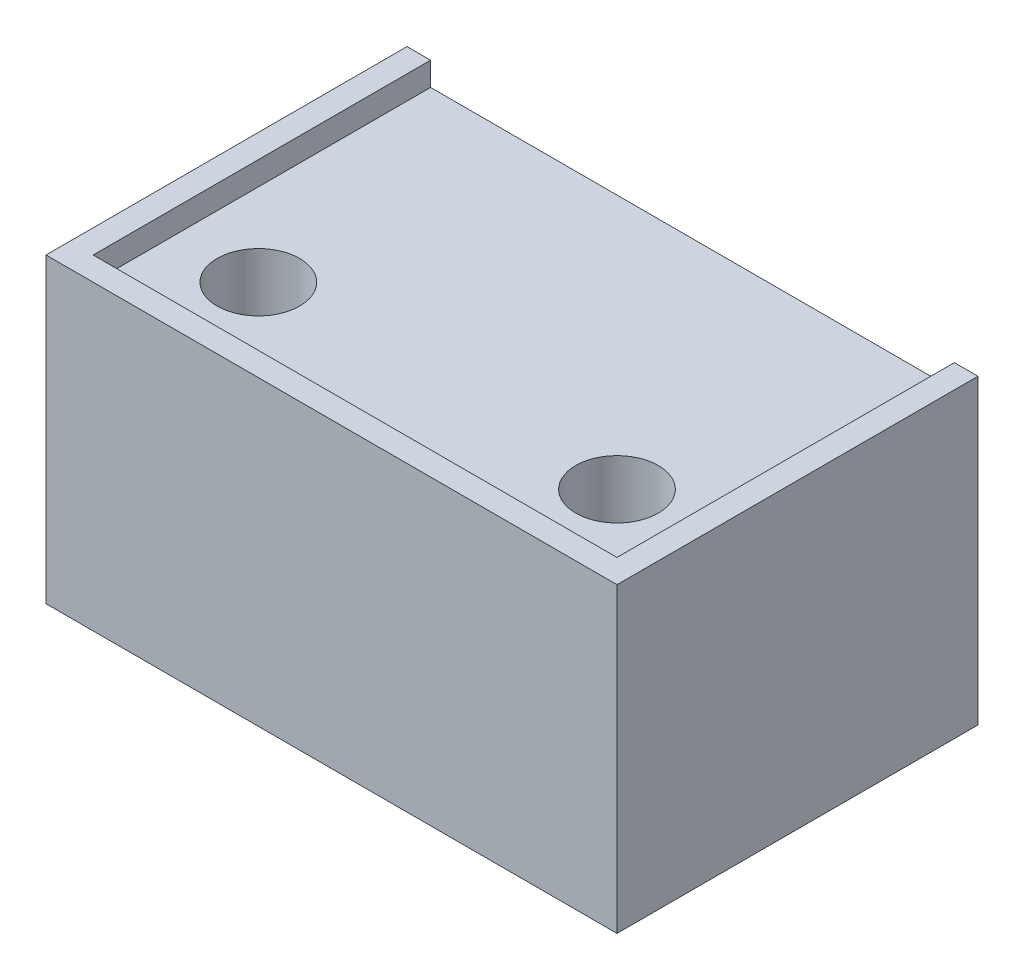
ISO-10303-21;
HEADER;
FILE_DESCRIPTION(('STEP AP214'),'2;1');
FILE_NAME('part.step','',(''),(''),'','','');
FILE_SCHEMA(('AUTOMOTIVE_DESIGN { 1 0 10303 214 1 1 1 1 }'));
ENDSEC;
DATA;
#1=APPLICATION_CONTEXT('core data for automotive mechanical design processes');
#2=APPLICATION_PROTOCOL_DEFINITION('international standard','automotive_design',2000,#1);
#3=PRODUCT_CONTEXT('',#1,'mechanical');
#4=PRODUCT('Part','Part','',(#3));
#5=PRODUCT_RELATED_PRODUCT_CATEGORY('part','',(#4));
#6=PRODUCT_DEFINITION_FORMATION('','',#4);
#7=PRODUCT_DEFINITION_CONTEXT('part definition',#1,'design');
#8=PRODUCT_DEFINITION('design','',#6,#7);
#9=PRODUCT_DEFINITION_SHAPE('','',#8);
#10=(LENGTH_UNIT() NAMED_UNIT(*) SI_UNIT(.MILLI.,.METRE.));
#11=(NAMED_UNIT(*) PLANE_ANGLE_UNIT() SI_UNIT($,.RADIAN.));
#12=(NAMED_UNIT(*) SI_UNIT($,.STERADIAN.) SOLID_ANGLE_UNIT());
#13=UNCERTAINTY_MEASURE_WITH_UNIT(LENGTH_MEASURE(1.E-05),#10,'distance_accuracy_value','');
#14=(GEOMETRIC_REPRESENTATION_CONTEXT(3) GLOBAL_UNCERTAINTY_ASSIGNED_CONTEXT((#13)) GLOBAL_UNIT_ASSIGNED_CONTEXT((#10,
#11,#12)) REPRESENTATION_CONTEXT('',''));
#15=CARTESIAN_POINT('',(0.,0.,0.));
#16=DIRECTION('',(0.,0.,1.));
#17=DIRECTION('',(1.,0.,0.));
#18=AXIS2_PLACEMENT_3D('',#15,#16,#17);
#19=CARTESIAN_POINT('',(0.,11.8,-6.65));
#20=DIRECTION('',(0.,0.,-1.));
#21=DIRECTION('',(-1.,0.,0.));
#22=AXIS2_PLACEMENT_3D('',#19,#20,#21);
#23=PLANE('',#22);
#24=DIRECTION('',(1.,0.,0.));
#25=VECTOR('',#24,1.);
#26=CARTESIAN_POINT('',(0.,0.,-6.65));
#27=LINE('',#26,#25);
#28=CARTESIAN_POINT('',(-12.1,0.,-6.65000000000001));
#29=VERTEX_POINT('',#28);
#30=CARTESIAN_POINT('',(12.1,0.,-6.65000000000001));
#31=VERTEX_POINT('',#30);
#32=EDGE_CURVE('E139',#29,#31,#27,.T.);
#33=ORIENTED_EDGE('',*,*,#32,.F.);
#34=DIRECTION('',(0.,-1.,0.));
#35=VECTOR('',#34,1.);
#36=CARTESIAN_POINT('',(-12.1,12.8,-6.65000000000001));
#37=LINE('',#36,#35);
#38=CARTESIAN_POINT('',(-12.1,12.8,-6.65000000000001));
#39=VERTEX_POINT('',#38);
#40=EDGE_CURVE('E351',#39,#29,#37,.T.);
#41=ORIENTED_EDGE('',*,*,#40,.F.);
#42=DIRECTION('',(-1.,0.,0.));
#43=VECTOR('',#42,1.);
#44=CARTESIAN_POINT('',(0.,12.8,-6.65000000000001));
#45=LINE('',#44,#43);
#46=CARTESIAN_POINT('',(-11.1,12.8,-6.65000000000001));
#47=VERTEX_POINT('',#46);
#48=EDGE_CURVE('E377',#47,#39,#45,.T.);
#49=ORIENTED_EDGE('',*,*,#48,.F.);
#50=DIRECTION('',(0.,-1.,0.));
#51=VECTOR('',#50,1.);
#52=CARTESIAN_POINT('',(-11.1,12.8,-6.65000000000001));
#53=LINE('',#52,#51);
#54=CARTESIAN_POINT('',(-11.1,11.8,-6.65000000000001));
#55=VERTEX_POINT('',#54);
#56=EDGE_CURVE('E355',#47,#55,#53,.T.);
#57=ORIENTED_EDGE('',*,*,#56,.T.);
#58=DIRECTION('',(1.,0.,0.));
#59=VECTOR('',#58,1.);
#60=CARTESIAN_POINT('',(0.,11.8,-6.65));
#61=LINE('',#60,#59);
#62=CARTESIAN_POINT('',(11.1,11.8,-6.65000000000001));
#63=VERTEX_POINT('',#62);
#64=EDGE_CURVE('E152',#55,#63,#61,.T.);
#65=ORIENTED_EDGE('',*,*,#64,.T.);
#66=DIRECTION('',(0.,-1.,0.));
#67=VECTOR('',#66,1.);
#68=CARTESIAN_POINT('',(11.1,12.8,-6.65000000000001));
#69=LINE('',#68,#67);
#70=CARTESIAN_POINT('',(11.1,12.8,-6.65000000000001));
#71=VERTEX_POINT('',#70);
#72=EDGE_CURVE('E117',#71,#63,#69,.T.);
#73=ORIENTED_EDGE('',*,*,#72,.F.);
#74=DIRECTION('',(-1.,0.,0.));
#75=VECTOR('',#74,1.);
#76=CARTESIAN_POINT('',(0.,12.8,-6.65000000000001));
#77=LINE('',#76,#75);
#78=CARTESIAN_POINT('',(12.1,12.8,-6.65000000000001));
#79=VERTEX_POINT('',#78);
#80=EDGE_CURVE('E110',#79,#71,#77,.T.);
#81=ORIENTED_EDGE('',*,*,#80,.F.);
#82=DIRECTION('',(0.,-1.,0.));
#83=VECTOR('',#82,1.);
#84=CARTESIAN_POINT('',(12.1,12.8,-6.65000000000001));
#85=LINE('',#84,#83);
#86=EDGE_CURVE('E113',#79,#31,#85,.T.);
#87=ORIENTED_EDGE('',*,*,#86,.T.);
#88=EDGE_LOOP('',(#33,#41,#49,#57,#65,#73,#81,#87));
#89=FACE_BOUND('',#88,.T.);
#90=ADVANCED_FACE('F45',(#89),#23,.T.);
#91=CARTESIAN_POINT('',(-7.6,11.8,4.14999999999999));
#92=DIRECTION('',(0.,-1.,0.));
#93=DIRECTION('',(0.,0.,-1.));
#94=AXIS2_PLACEMENT_3D('',#91,#92,#93);
#95=CYLINDRICAL_SURFACE('',#94,1.75);
#96=CARTESIAN_POINT('',(-7.6,11.8,4.14999999999999));
#97=DIRECTION('',(0.,1.,0.));
#98=DIRECTION('',(0.,0.,1.));
#99=AXIS2_PLACEMENT_3D('',#96,#97,#98);
#100=CIRCLE('',#99,1.75);
#101=CARTESIAN_POINT('',(-7.6,11.8,5.89999999999999));
#102=VERTEX_POINT('',#101);
#103=EDGE_CURVE('E54',#102,#102,#100,.T.);
#104=ORIENTED_EDGE('',*,*,#103,.T.);
#105=EDGE_LOOP('',(#104));
#106=FACE_BOUND('',#105,.T.);
#107=CARTESIAN_POINT('',(-7.6,0.,4.14999999999999));
#108=DIRECTION('',(0.,1.,0.));
#109=DIRECTION('',(0.,0.,1.));
#110=AXIS2_PLACEMENT_3D('',#107,#108,#109);
#111=CIRCLE('',#110,1.75);
#112=CARTESIAN_POINT('',(-7.6,0.,5.89999999999999));
#113=VERTEX_POINT('',#112);
#114=EDGE_CURVE('E143',#113,#113,#111,.T.);
#115=ORIENTED_EDGE('',*,*,#114,.F.);
#116=EDGE_LOOP('',(#115));
#117=FACE_BOUND('',#116,.T.);
#118=ADVANCED_FACE('F185',(#106,#117),#95,.F.);
#119=CARTESIAN_POINT('',(7.6,11.8,4.14999999999999));
#120=DIRECTION('',(0.,-1.,0.));
#121=DIRECTION('',(0.,0.,-1.));
#122=AXIS2_PLACEMENT_3D('',#119,#120,#121);
#123=CYLINDRICAL_SURFACE('',#122,1.75);
#124=CARTESIAN_POINT('',(7.6,11.8,4.14999999999999));
#125=DIRECTION('',(0.,1.,0.));
#126=DIRECTION('',(0.,0.,1.));
#127=AXIS2_PLACEMENT_3D('',#124,#125,#126);
#128=CIRCLE('',#127,1.75);
#129=CARTESIAN_POINT('',(7.6,11.8,5.89999999999999));
#130=VERTEX_POINT('',#129);
#131=EDGE_CURVE('E11',#130,#130,#128,.F.);
#132=ORIENTED_EDGE('',*,*,#131,.F.);
#133=EDGE_LOOP('',(#132));
#134=FACE_BOUND('',#133,.T.);
#135=CARTESIAN_POINT('',(7.6,0.,4.14999999999999));
#136=DIRECTION('',(0.,1.,0.));
#137=DIRECTION('',(0.,0.,1.));
#138=AXIS2_PLACEMENT_3D('',#135,#136,#137);
#139=CIRCLE('',#138,1.75);
#140=CARTESIAN_POINT('',(7.6,0.,5.89999999999999));
#141=VERTEX_POINT('',#140);
#142=EDGE_CURVE('E48',#141,#141,#139,.F.);
#143=ORIENTED_EDGE('',*,*,#142,.T.);
#144=EDGE_LOOP('',(#143));
#145=FACE_BOUND('',#144,.T.);
#146=ADVANCED_FACE('F169',(#134,#145),#123,.F.);
#147=CARTESIAN_POINT('',(0.,11.8,0.));
#148=DIRECTION('',(0.,1.,0.));
#149=DIRECTION('',(0.,0.,1.));
#150=AXIS2_PLACEMENT_3D('',#147,#148,#149);
#151=PLANE('',#150);
#152=DIRECTION('',(0.,0.,-1.));
#153=VECTOR('',#152,1.);
#154=CARTESIAN_POINT('',(11.1,11.8,0.));
#155=LINE('',#154,#153);
#156=CARTESIAN_POINT('',(11.1,11.8,7.64999999999999));
#157=VERTEX_POINT('',#156);
#158=EDGE_CURVE('E149',#157,#63,#155,.T.);
#159=ORIENTED_EDGE('',*,*,#158,.T.);
#160=ORIENTED_EDGE('',*,*,#64,.F.);
#161=DIRECTION('',(0.,0.,1.));
#162=VECTOR('',#161,1.);
#163=CARTESIAN_POINT('',(-11.1,11.8,0.));
#164=LINE('',#163,#162);
#165=CARTESIAN_POINT('',(-11.1,11.8,7.64999999999999));
#166=VERTEX_POINT('',#165);
#167=EDGE_CURVE('E67',#55,#166,#164,.T.);
#168=ORIENTED_EDGE('',*,*,#167,.T.);
#169=DIRECTION('',(1.,0.,0.));
#170=VECTOR('',#169,1.);
#171=CARTESIAN_POINT('',(0.,11.8,7.64999999999999));
#172=LINE('',#171,#170);
#173=EDGE_CURVE('E62',#166,#157,#172,.T.);
#174=ORIENTED_EDGE('',*,*,#173,.T.);
#175=EDGE_LOOP('',(#159,#160,#168,#174));
#176=FACE_BOUND('',#175,.T.);
#177=ORIENTED_EDGE('',*,*,#103,.F.);
#178=EDGE_LOOP('',(#177));
#179=FACE_BOUND('',#178,.T.);
#180=ORIENTED_EDGE('',*,*,#131,.T.);
#181=EDGE_LOOP('',(#180));
#182=FACE_BOUND('',#181,.T.);
#183=ADVANCED_FACE('F173',(#176,#179,#182),#151,.T.);
#184=CARTESIAN_POINT('',(0.,0.,0.));
#185=DIRECTION('',(0.,1.,0.));
#186=DIRECTION('',(0.,0.,1.));
#187=AXIS2_PLACEMENT_3D('',#184,#185,#186);
#188=PLANE('',#187);
#189=ORIENTED_EDGE('',*,*,#32,.T.);
#190=DIRECTION('',(0.,0.,-1.));
#191=VECTOR('',#190,1.);
#192=CARTESIAN_POINT('',(12.1,0.,0.));
#193=LINE('',#192,#191);
#194=CARTESIAN_POINT('',(12.1,0.,8.64999999999999));
#195=VERTEX_POINT('',#194);
#196=EDGE_CURVE('E137',#195,#31,#193,.T.);
#197=ORIENTED_EDGE('',*,*,#196,.F.);
#198=DIRECTION('',(1.,0.,0.));
#199=VECTOR('',#198,1.);
#200=CARTESIAN_POINT('',(0.,0.,8.64999999999999));
#201=LINE('',#200,#199);
#202=CARTESIAN_POINT('',(-12.1,0.,8.64999999999999));
#203=VERTEX_POINT('',#202);
#204=EDGE_CURVE('E133',#203,#195,#201,.T.);
#205=ORIENTED_EDGE('',*,*,#204,.F.);
#206=DIRECTION('',(0.,0.,1.));
#207=VECTOR('',#206,1.);
#208=CARTESIAN_POINT('',(-12.1,0.,0.));
#209=LINE('',#208,#207);
#210=EDGE_CURVE('E338',#29,#203,#209,.T.);
#211=ORIENTED_EDGE('',*,*,#210,.F.);
#212=EDGE_LOOP('',(#189,#197,#205,#211));
#213=FACE_BOUND('',#212,.T.);
#214=ORIENTED_EDGE('',*,*,#114,.T.);
#215=EDGE_LOOP('',(#214));
#216=FACE_BOUND('',#215,.T.);
#217=ORIENTED_EDGE('',*,*,#142,.F.);
#218=EDGE_LOOP('',(#217));
#219=FACE_BOUND('',#218,.T.);
#220=ADVANCED_FACE('F171',(#213,#216,#219),#188,.F.);
#221=CARTESIAN_POINT('',(12.1,12.8,0.));
#222=DIRECTION('',(-1.,0.,0.));
#223=DIRECTION('',(0.,0.,1.));
#224=AXIS2_PLACEMENT_3D('',#221,#222,#223);
#225=PLANE('',#224);
#226=ORIENTED_EDGE('',*,*,#196,.T.);
#227=ORIENTED_EDGE('',*,*,#86,.F.);
#228=DIRECTION('',(0.,0.,-1.));
#229=VECTOR('',#228,1.);
#230=CARTESIAN_POINT('',(12.1,12.8,0.));
#231=LINE('',#230,#229);
#232=CARTESIAN_POINT('',(12.1,12.8,8.64999999999999));
#233=VERTEX_POINT('',#232);
#234=EDGE_CURVE('E123',#233,#79,#231,.T.);
#235=ORIENTED_EDGE('',*,*,#234,.F.);
#236=DIRECTION('',(0.,-1.,0.));
#237=VECTOR('',#236,1.);
#238=CARTESIAN_POINT('',(12.1,12.8,8.64999999999999));
#239=LINE('',#238,#237);
#240=EDGE_CURVE('E333',#233,#195,#239,.T.);
#241=ORIENTED_EDGE('',*,*,#240,.T.);
#242=EDGE_LOOP('',(#226,#227,#235,#241));
#243=FACE_BOUND('',#242,.T.);
#244=ADVANCED_FACE('F135',(#243),#225,.F.);
#245=CARTESIAN_POINT('',(11.1,12.8,0.));
#246=DIRECTION('',(-1.,0.,0.));
#247=DIRECTION('',(0.,0.,1.));
#248=AXIS2_PLACEMENT_3D('',#245,#246,#247);
#249=PLANE('',#248);
#250=ORIENTED_EDGE('',*,*,#72,.T.);
#251=ORIENTED_EDGE('',*,*,#158,.F.);
#252=DIRECTION('',(0.,-1.,0.));
#253=VECTOR('',#252,1.);
#254=CARTESIAN_POINT('',(11.1,12.8,7.64999999999999));
#255=LINE('',#254,#253);
#256=CARTESIAN_POINT('',(11.1,12.8,7.64999999999999));
#257=VERTEX_POINT('',#256);
#258=EDGE_CURVE('E145',#257,#157,#255,.T.);
#259=ORIENTED_EDGE('',*,*,#258,.F.);
#260=DIRECTION('',(0.,0.,-1.));
#261=VECTOR('',#260,1.);
#262=CARTESIAN_POINT('',(11.1,12.8,0.));
#263=LINE('',#262,#261);
#264=EDGE_CURVE('E122',#257,#71,#263,.T.);
#265=ORIENTED_EDGE('',*,*,#264,.T.);
#266=EDGE_LOOP('',(#250,#251,#259,#265));
#267=FACE_BOUND('',#266,.T.);
#268=ADVANCED_FACE('F180',(#267),#249,.T.);
#269=CARTESIAN_POINT('',(0.,12.8,7.64999999999999));
#270=DIRECTION('',(0.,0.,-1.));
#271=DIRECTION('',(-1.,0.,0.));
#272=AXIS2_PLACEMENT_3D('',#269,#270,#271);
#273=PLANE('',#272);
#274=ORIENTED_EDGE('',*,*,#258,.T.);
#275=ORIENTED_EDGE('',*,*,#173,.F.);
#276=DIRECTION('',(0.,-1.,0.));
#277=VECTOR('',#276,1.);
#278=CARTESIAN_POINT('',(-11.1,12.8,7.64999999999999));
#279=LINE('',#278,#277);
#280=CARTESIAN_POINT('',(-11.1,12.8,7.64999999999999));
#281=VERTEX_POINT('',#280);
#282=EDGE_CURVE('E359',#281,#166,#279,.T.);
#283=ORIENTED_EDGE('',*,*,#282,.F.);
#284=DIRECTION('',(1.,0.,0.));
#285=VECTOR('',#284,1.);
#286=CARTESIAN_POINT('',(0.,12.8,7.64999999999999));
#287=LINE('',#286,#285);
#288=EDGE_CURVE('E366',#281,#257,#287,.T.);
#289=ORIENTED_EDGE('',*,*,#288,.T.);
#290=EDGE_LOOP('',(#274,#275,#283,#289));
#291=FACE_BOUND('',#290,.T.);
#292=ADVANCED_FACE('F230',(#291),#273,.T.);
#293=CARTESIAN_POINT('',(-11.1,12.8,0.));
#294=DIRECTION('',(1.,0.,0.));
#295=DIRECTION('',(0.,0.,-1.));
#296=AXIS2_PLACEMENT_3D('',#293,#294,#295);
#297=PLANE('',#296);
#298=ORIENTED_EDGE('',*,*,#282,.T.);
#299=ORIENTED_EDGE('',*,*,#167,.F.);
#300=ORIENTED_EDGE('',*,*,#56,.F.);
#301=DIRECTION('',(0.,0.,1.));
#302=VECTOR('',#301,1.);
#303=CARTESIAN_POINT('',(-11.1,12.8,0.));
#304=LINE('',#303,#302);
#305=EDGE_CURVE('E372',#47,#281,#304,.T.);
#306=ORIENTED_EDGE('',*,*,#305,.T.);
#307=EDGE_LOOP('',(#298,#299,#300,#306));
#308=FACE_BOUND('',#307,.T.);
#309=ADVANCED_FACE('F241',(#308),#297,.T.);
#310=CARTESIAN_POINT('',(-12.1,12.8,0.));
#311=DIRECTION('',(1.,0.,0.));
#312=DIRECTION('',(0.,0.,-1.));
#313=AXIS2_PLACEMENT_3D('',#310,#311,#312);
#314=PLANE('',#313);
#315=ORIENTED_EDGE('',*,*,#210,.T.);
#316=DIRECTION('',(0.,-1.,0.));
#317=VECTOR('',#316,1.);
#318=CARTESIAN_POINT('',(-12.1,12.8,8.64999999999999));
#319=LINE('',#318,#317);
#320=CARTESIAN_POINT('',(-12.1,12.8,8.64999999999999));
#321=VERTEX_POINT('',#320);
#322=EDGE_CURVE('E335',#321,#203,#319,.T.);
#323=ORIENTED_EDGE('',*,*,#322,.F.);
#324=DIRECTION('',(0.,0.,1.));
#325=VECTOR('',#324,1.);
#326=CARTESIAN_POINT('',(-12.1,12.8,0.));
#327=LINE('',#326,#325);
#328=EDGE_CURVE('E379',#39,#321,#327,.T.);
#329=ORIENTED_EDGE('',*,*,#328,.F.);
#330=ORIENTED_EDGE('',*,*,#40,.T.);
#331=EDGE_LOOP('',(#315,#323,#329,#330));
#332=FACE_BOUND('',#331,.T.);
#333=ADVANCED_FACE('F252',(#332),#314,.F.);
#334=CARTESIAN_POINT('',(0.,12.8,8.64999999999999));
#335=DIRECTION('',(0.,0.,-1.));
#336=DIRECTION('',(-1.,0.,0.));
#337=AXIS2_PLACEMENT_3D('',#334,#335,#336);
#338=PLANE('',#337);
#339=ORIENTED_EDGE('',*,*,#204,.T.);
#340=ORIENTED_EDGE('',*,*,#240,.F.);
#341=DIRECTION('',(1.,0.,0.));
#342=VECTOR('',#341,1.);
#343=CARTESIAN_POINT('',(0.,12.8,8.64999999999999));
#344=LINE('',#343,#342);
#345=EDGE_CURVE('E128',#321,#233,#344,.T.);
#346=ORIENTED_EDGE('',*,*,#345,.F.);
#347=ORIENTED_EDGE('',*,*,#322,.T.);
#348=EDGE_LOOP('',(#339,#340,#346,#347));
#349=FACE_BOUND('',#348,.T.);
#350=ADVANCED_FACE('F263',(#349),#338,.F.);
#351=CARTESIAN_POINT('',(0.,12.8,0.));
#352=DIRECTION('',(0.,1.,0.));
#353=DIRECTION('',(0.,0.,1.));
#354=AXIS2_PLACEMENT_3D('',#351,#352,#353);
#355=PLANE('',#354);
#356=ORIENTED_EDGE('',*,*,#234,.T.);
#357=ORIENTED_EDGE('',*,*,#80,.T.);
#358=ORIENTED_EDGE('',*,*,#264,.F.);
#359=ORIENTED_EDGE('',*,*,#288,.F.);
#360=ORIENTED_EDGE('',*,*,#305,.F.);
#361=ORIENTED_EDGE('',*,*,#48,.T.);
#362=ORIENTED_EDGE('',*,*,#328,.T.);
#363=ORIENTED_EDGE('',*,*,#345,.T.);
#364=EDGE_LOOP('',(#356,#357,#358,#359,#360,#361,#362,#363));
#365=FACE_BOUND('',#364,.T.);
#366=ADVANCED_FACE('F126',(#365),#355,.T.);
#367=CLOSED_SHELL('',(#90,#118,#146,#183,#220,#244,#268,#292,#309,#333,#350,#366));
#368=MANIFOLD_SOLID_BREP('B2',#367);
#369=ADVANCED_BREP_SHAPE_REPRESENTATION('',(#18,#368),#14);
#370=SHAPE_DEFINITION_REPRESENTATION(#9,#369);
ENDSEC;
END-ISO-10303-21;
